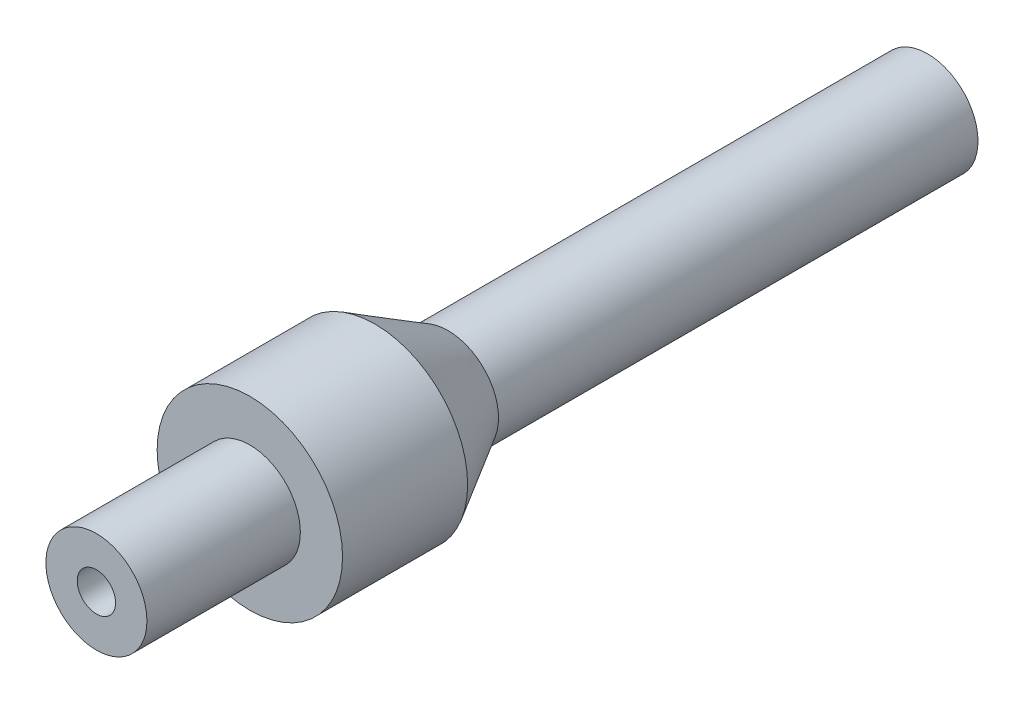
ISO-10303-21;
HEADER;
FILE_DESCRIPTION(('STEP AP214'),'2;1');
FILE_NAME('part.step','',(''),(''),'','','');
FILE_SCHEMA(('AUTOMOTIVE_DESIGN { 1 0 10303 214 1 1 1 1 }'));
ENDSEC;
DATA;
#1=APPLICATION_CONTEXT('core data for automotive mechanical design processes');
#2=APPLICATION_PROTOCOL_DEFINITION('international standard','automotive_design',2000,#1);
#3=PRODUCT_CONTEXT('',#1,'mechanical');
#4=PRODUCT('Part','Part','',(#3));
#5=PRODUCT_RELATED_PRODUCT_CATEGORY('part','',(#4));
#6=PRODUCT_DEFINITION_FORMATION('','',#4);
#7=PRODUCT_DEFINITION_CONTEXT('part definition',#1,'design');
#8=PRODUCT_DEFINITION('design','',#6,#7);
#9=PRODUCT_DEFINITION_SHAPE('','',#8);
#10=(LENGTH_UNIT() NAMED_UNIT(*) SI_UNIT(.MILLI.,.METRE.));
#11=(NAMED_UNIT(*) PLANE_ANGLE_UNIT() SI_UNIT($,.RADIAN.));
#12=(NAMED_UNIT(*) SI_UNIT($,.STERADIAN.) SOLID_ANGLE_UNIT());
#13=UNCERTAINTY_MEASURE_WITH_UNIT(LENGTH_MEASURE(1.E-05),#10,'distance_accuracy_value','');
#14=(GEOMETRIC_REPRESENTATION_CONTEXT(3) GLOBAL_UNCERTAINTY_ASSIGNED_CONTEXT((#13)) GLOBAL_UNIT_ASSIGNED_CONTEXT((#10,
#11,#12)) REPRESENTATION_CONTEXT('',''));
#15=CARTESIAN_POINT('',(0.,0.,0.));
#16=DIRECTION('',(0.,0.,1.));
#17=DIRECTION('',(1.,0.,0.));
#18=AXIS2_PLACEMENT_3D('',#15,#16,#17);
#19=CARTESIAN_POINT('',(0.,0.,0.));
#20=DIRECTION('',(0.,0.,1.));
#21=DIRECTION('',(1.,0.,0.));
#22=AXIS2_PLACEMENT_3D('',#19,#20,#21);
#23=CYLINDRICAL_SURFACE('',#22,1.5);
#24=CARTESIAN_POINT('',(0.,0.,0.));
#25=DIRECTION('',(0.,0.,1.));
#26=DIRECTION('',(1.,0.,0.));
#27=AXIS2_PLACEMENT_3D('',#24,#25,#26);
#28=CIRCLE('',#27,1.5);
#29=CARTESIAN_POINT('',(1.5,0.,0.));
#30=VERTEX_POINT('',#29);
#31=EDGE_CURVE('E66',#30,#30,#28,.T.);
#32=ORIENTED_EDGE('',*,*,#31,.T.);
#33=EDGE_LOOP('',(#32));
#34=FACE_BOUND('',#33,.T.);
#35=CARTESIAN_POINT('',(0.,0.,-65.));
#36=DIRECTION('',(0.,0.,1.));
#37=DIRECTION('',(1.,0.,0.));
#38=AXIS2_PLACEMENT_3D('',#35,#36,#37);
#39=CIRCLE('',#38,1.5);
#40=CARTESIAN_POINT('',(1.5,0.,-65.));
#41=VERTEX_POINT('',#40);
#42=EDGE_CURVE('E48',#41,#41,#39,.T.);
#43=ORIENTED_EDGE('',*,*,#42,.F.);
#44=EDGE_LOOP('',(#43));
#45=FACE_BOUND('',#44,.T.);
#46=ADVANCED_FACE('F36',(#34,#45),#23,.F.);
#47=CARTESIAN_POINT('',(1.5,0.,-65.));
#48=DIRECTION('',(0.,0.,-1.));
#49=DIRECTION('',(-1.,0.,0.));
#50=AXIS2_PLACEMENT_3D('',#47,#48,#49);
#51=PLANE('',#50);
#52=ORIENTED_EDGE('',*,*,#42,.T.);
#53=EDGE_LOOP('',(#52));
#54=FACE_BOUND('',#53,.T.);
#55=CARTESIAN_POINT('',(0.,0.,-65.));
#56=DIRECTION('',(0.,0.,1.));
#57=DIRECTION('',(1.,0.,0.));
#58=AXIS2_PLACEMENT_3D('',#55,#56,#57);
#59=CIRCLE('',#58,3.94999999999999);
#60=CARTESIAN_POINT('',(3.94999999999999,0.,-65.));
#61=VERTEX_POINT('',#60);
#62=EDGE_CURVE('E52',#61,#61,#59,.T.);
#63=ORIENTED_EDGE('',*,*,#62,.F.);
#64=EDGE_LOOP('',(#63));
#65=FACE_BOUND('',#64,.T.);
#66=ADVANCED_FACE('F86',(#54,#65),#51,.T.);
#67=CARTESIAN_POINT('',(0.,0.,0.));
#68=DIRECTION('',(0.,0.,1.));
#69=DIRECTION('',(1.,0.,0.));
#70=AXIS2_PLACEMENT_3D('',#67,#68,#69);
#71=CYLINDRICAL_SURFACE('',#70,3.95);
#72=CARTESIAN_POINT('',(0.,0.,-27.5));
#73=DIRECTION('',(0.,0.,-1.));
#74=DIRECTION('',(-1.,0.,0.));
#75=AXIS2_PLACEMENT_3D('',#72,#73,#74);
#76=CIRCLE('',#75,3.95);
#77=CARTESIAN_POINT('',(-3.95,0.,-27.5));
#78=VERTEX_POINT('',#77);
#79=EDGE_CURVE('E44',#78,#78,#76,.T.);
#80=ORIENTED_EDGE('',*,*,#79,.T.);
#81=EDGE_LOOP('',(#80));
#82=FACE_BOUND('',#81,.T.);
#83=ORIENTED_EDGE('',*,*,#62,.T.);
#84=EDGE_LOOP('',(#83));
#85=FACE_BOUND('',#84,.T.);
#86=ADVANCED_FACE('F90',(#82,#85),#71,.T.);
#87=CARTESIAN_POINT('',(0.,0.,0.));
#88=DIRECTION('',(0.,0.,1.));
#89=DIRECTION('',(1.,0.,0.));
#90=AXIS2_PLACEMENT_3D('',#87,#88,#89);
#91=CYLINDRICAL_SURFACE('',#90,7.25);
#92=CARTESIAN_POINT('',(0.,0.,-21.7842323350228));
#93=DIRECTION('',(0.,0.,1.));
#94=DIRECTION('',(1.,0.,0.));
#95=AXIS2_PLACEMENT_3D('',#92,#93,#94);
#96=CIRCLE('',#95,7.25);
#97=CARTESIAN_POINT('',(7.25,0.,-21.7842323350228));
#98=VERTEX_POINT('',#97);
#99=EDGE_CURVE('E10',#98,#98,#96,.T.);
#100=ORIENTED_EDGE('',*,*,#99,.T.);
#101=EDGE_LOOP('',(#100));
#102=FACE_BOUND('',#101,.T.);
#103=CARTESIAN_POINT('',(0.,0.,-12.));
#104=DIRECTION('',(0.,0.,1.));
#105=DIRECTION('',(1.,0.,0.));
#106=AXIS2_PLACEMENT_3D('',#103,#104,#105);
#107=CIRCLE('',#106,7.25);
#108=CARTESIAN_POINT('',(7.25,0.,-12.));
#109=VERTEX_POINT('',#108);
#110=EDGE_CURVE('E57',#109,#109,#107,.T.);
#111=ORIENTED_EDGE('',*,*,#110,.F.);
#112=EDGE_LOOP('',(#111));
#113=FACE_BOUND('',#112,.T.);
#114=ADVANCED_FACE('F96',(#102,#113),#91,.T.);
#115=CARTESIAN_POINT('',(7.25,0.,-12.));
#116=DIRECTION('',(0.,0.,1.));
#117=DIRECTION('',(1.,0.,0.));
#118=AXIS2_PLACEMENT_3D('',#115,#116,#117);
#119=PLANE('',#118);
#120=ORIENTED_EDGE('',*,*,#110,.T.);
#121=EDGE_LOOP('',(#120));
#122=FACE_BOUND('',#121,.T.);
#123=CARTESIAN_POINT('',(0.,0.,-12.));
#124=DIRECTION('',(0.,0.,1.));
#125=DIRECTION('',(1.,0.,0.));
#126=AXIS2_PLACEMENT_3D('',#123,#124,#125);
#127=CIRCLE('',#126,3.95);
#128=CARTESIAN_POINT('',(3.95,0.,-12.));
#129=VERTEX_POINT('',#128);
#130=EDGE_CURVE('E60',#129,#129,#127,.T.);
#131=ORIENTED_EDGE('',*,*,#130,.F.);
#132=EDGE_LOOP('',(#131));
#133=FACE_BOUND('',#132,.T.);
#134=ADVANCED_FACE('F82',(#122,#133),#119,.T.);
#135=CARTESIAN_POINT('',(0.,0.,0.));
#136=DIRECTION('',(0.,0.,1.));
#137=DIRECTION('',(1.,0.,0.));
#138=AXIS2_PLACEMENT_3D('',#135,#136,#137);
#139=CYLINDRICAL_SURFACE('',#138,3.95);
#140=ORIENTED_EDGE('',*,*,#130,.T.);
#141=EDGE_LOOP('',(#140));
#142=FACE_BOUND('',#141,.T.);
#143=CARTESIAN_POINT('',(0.,0.,0.));
#144=DIRECTION('',(0.,0.,1.));
#145=DIRECTION('',(1.,0.,0.));
#146=AXIS2_PLACEMENT_3D('',#143,#144,#145);
#147=CIRCLE('',#146,3.95);
#148=CARTESIAN_POINT('',(3.95,0.,0.));
#149=VERTEX_POINT('',#148);
#150=EDGE_CURVE('E63',#149,#149,#147,.T.);
#151=ORIENTED_EDGE('',*,*,#150,.F.);
#152=EDGE_LOOP('',(#151));
#153=FACE_BOUND('',#152,.T.);
#154=ADVANCED_FACE('F74',(#142,#153),#139,.T.);
#155=CARTESIAN_POINT('',(1.5,0.,0.));
#156=DIRECTION('',(0.,0.,1.));
#157=DIRECTION('',(1.,0.,0.));
#158=AXIS2_PLACEMENT_3D('',#155,#156,#157);
#159=PLANE('',#158);
#160=ORIENTED_EDGE('',*,*,#150,.T.);
#161=EDGE_LOOP('',(#160));
#162=FACE_BOUND('',#161,.T.);
#163=ORIENTED_EDGE('',*,*,#31,.F.);
#164=EDGE_LOOP('',(#163));
#165=FACE_BOUND('',#164,.T.);
#166=ADVANCED_FACE('F72',(#162,#165),#159,.T.);
#167=CARTESIAN_POINT('',(0.,0.,-17.));
#168=DIRECTION('',(0.,0.,1.));
#169=DIRECTION('',(1.,0.,0.));
#170=AXIS2_PLACEMENT_3D('',#167,#168,#169);
#171=CONICAL_SURFACE('',#170,10.0121778264912,0.523598775598305);
#172=ORIENTED_EDGE('',*,*,#79,.F.);
#173=EDGE_LOOP('',(#172));
#174=FACE_BOUND('',#173,.T.);
#175=ORIENTED_EDGE('',*,*,#99,.F.);
#176=EDGE_LOOP('',(#175));
#177=FACE_BOUND('',#176,.T.);
#178=ADVANCED_FACE('F39',(#174,#177),#171,.T.);
#179=CLOSED_SHELL('',(#46,#66,#86,#114,#134,#154,#166,#178));
#180=MANIFOLD_SOLID_BREP('B2',#179);
#181=ADVANCED_BREP_SHAPE_REPRESENTATION('',(#18,#180),#14);
#182=SHAPE_DEFINITION_REPRESENTATION(#9,#181);
ENDSEC;
END-ISO-10303-21;
